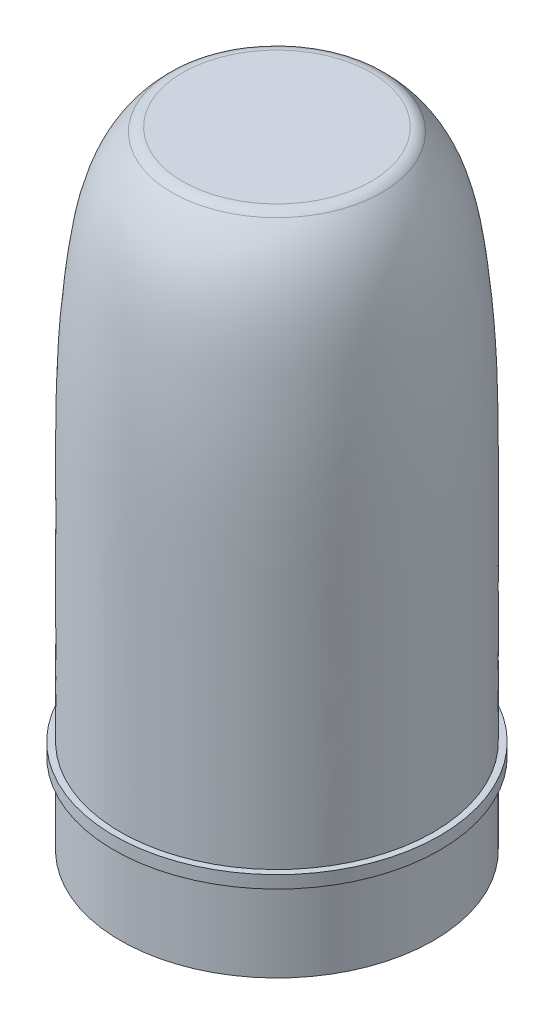
ISO-10303-21;
HEADER;
FILE_DESCRIPTION(('STEP AP214'),'2;1');
FILE_NAME('part.step','',(''),(''),'','','');
FILE_SCHEMA(('AUTOMOTIVE_DESIGN { 1 0 10303 214 1 1 1 1 }'));
ENDSEC;
DATA;
#1=APPLICATION_CONTEXT('core data for automotive mechanical design processes');
#2=APPLICATION_PROTOCOL_DEFINITION('international standard','automotive_design',2000,#1);
#3=PRODUCT_CONTEXT('',#1,'mechanical');
#4=PRODUCT('Part','Part','',(#3));
#5=PRODUCT_RELATED_PRODUCT_CATEGORY('part','',(#4));
#6=PRODUCT_DEFINITION_FORMATION('','',#4);
#7=PRODUCT_DEFINITION_CONTEXT('part definition',#1,'design');
#8=PRODUCT_DEFINITION('design','',#6,#7);
#9=PRODUCT_DEFINITION_SHAPE('','',#8);
#10=(LENGTH_UNIT() NAMED_UNIT(*) SI_UNIT(.MILLI.,.METRE.));
#11=(NAMED_UNIT(*) PLANE_ANGLE_UNIT() SI_UNIT($,.RADIAN.));
#12=(NAMED_UNIT(*) SI_UNIT($,.STERADIAN.) SOLID_ANGLE_UNIT());
#13=UNCERTAINTY_MEASURE_WITH_UNIT(LENGTH_MEASURE(1.E-05),#10,'distance_accuracy_value','');
#14=(GEOMETRIC_REPRESENTATION_CONTEXT(3) GLOBAL_UNCERTAINTY_ASSIGNED_CONTEXT((#13)) GLOBAL_UNIT_ASSIGNED_CONTEXT((#10,
#11,#12)) REPRESENTATION_CONTEXT('',''));
#15=CARTESIAN_POINT('',(0.,0.,0.));
#16=DIRECTION('',(0.,0.,1.));
#17=DIRECTION('',(1.,0.,0.));
#18=AXIS2_PLACEMENT_3D('',#15,#16,#17);
#19=CARTESIAN_POINT('',(0.,136.089238845144,0.));
#20=DIRECTION('',(0.,1.,0.));
#21=DIRECTION('',(-1.,0.,0.));
#22=AXIS2_PLACEMENT_3D('',#19,#20,#21);
#23=PLANE('',#22);
#24=CARTESIAN_POINT('',(0.,136.089238845144,0.));
#25=DIRECTION('',(0.,1.,0.));
#26=DIRECTION('',(-1.,0.,0.));
#27=AXIS2_PLACEMENT_3D('',#24,#25,#26);
#28=CIRCLE('',#27,30.1161809415321);
#29=CARTESIAN_POINT('',(-30.1161809415321,136.089238845144,0.));
#30=VERTEX_POINT('',#29);
#31=EDGE_CURVE('E10',#30,#30,#28,.T.);
#32=ORIENTED_EDGE('',*,*,#31,.T.);
#33=EDGE_LOOP('',(#32));
#34=FACE_BOUND('',#33,.T.);
#35=ADVANCED_FACE('F32',(#34),#23,.T.);
#36=CARTESIAN_POINT('',(50.,-35.9107611548556,0.));
#37=CARTESIAN_POINT('',(50.,-35.244094488189,0.));
#38=CARTESIAN_POINT('',(50.,-34.5774278215223,0.));
#39=CARTESIAN_POINT('',(50.,-33.9107611548557,0.));
#40=CARTESIAN_POINT('',(50.,-14.8788054545156,0.));
#41=CARTESIAN_POINT('',(49.9770326751951,15.5937770638381,0.));
#42=CARTESIAN_POINT('',(50.0284303503971,66.0334666511325,0.));
#43=CARTESIAN_POINT('',(49.0347974443936,90.86573887531,0.));
#44=CARTESIAN_POINT('',(43.5244085837036,126.615462550547,0.));
#45=CARTESIAN_POINT('',(32.,136.089238845144,0.));
#46=B_SPLINE_CURVE_WITH_KNOTS('',3,(#36,#37,#38,#39,#40,#41,#42,#43,#44,#45),.UNSPECIFIED.,.F.,
.F.,(4,3,1,1,1,4),(-0.0110858120131928,0.,0.316477024706082,0.388370289544209,0.71893264838127,
1.),.UNSPECIFIED.);
#47=CARTESIAN_POINT('',(0.,-63.9107611548556,0.));
#48=DIRECTION('',(0.,-1.,0.));
#49=AXIS1_PLACEMENT('',#47,#48);
#50=SURFACE_OF_REVOLUTION('',#46,#49);
#51=CARTESIAN_POINT('',(0.,134.726765899722,0.));
#52=DIRECTION('',(0.,-1.,0.));
#53=DIRECTION('',(1.,0.,0.));
#54=AXIS2_PLACEMENT_3D('',#51,#52,#53);
#55=CIRCLE('',#54,33.5466906598119);
#56=CARTESIAN_POINT('',(33.5466906598119,134.726765899722,0.));
#57=VERTEX_POINT('',#56);
#58=EDGE_CURVE('E39',#57,#57,#55,.T.);
#59=ORIENTED_EDGE('',*,*,#58,.T.);
#60=EDGE_LOOP('',(#59));
#61=FACE_BOUND('',#60,.T.);
#62=CARTESIAN_POINT('',(0.,-33.9107611548557,0.));
#63=DIRECTION('',(0.,-1.,0.));
#64=DIRECTION('',(1.,0.,0.));
#65=AXIS2_PLACEMENT_3D('',#62,#63,#64);
#66=CIRCLE('',#65,50.);
#67=CARTESIAN_POINT('',(50.,-33.9107611548557,0.));
#68=VERTEX_POINT('',#67);
#69=EDGE_CURVE('E43',#68,#68,#66,.T.);
#70=ORIENTED_EDGE('',*,*,#69,.F.);
#71=EDGE_LOOP('',(#70));
#72=FACE_BOUND('',#71,.T.);
#73=ADVANCED_FACE('F72',(#61,#72),#50,.F.);
#74=CARTESIAN_POINT('',(52.,-33.9107611548557,0.));
#75=DIRECTION('',(0.,1.,0.));
#76=DIRECTION('',(-1.,0.,0.));
#77=AXIS2_PLACEMENT_3D('',#74,#75,#76);
#78=PLANE('',#77);
#79=ORIENTED_EDGE('',*,*,#69,.T.);
#80=EDGE_LOOP('',(#79));
#81=FACE_BOUND('',#80,.T.);
#82=CARTESIAN_POINT('',(0.,-33.9107611548557,0.));
#83=DIRECTION('',(0.,-1.,0.));
#84=DIRECTION('',(1.,0.,0.));
#85=AXIS2_PLACEMENT_3D('',#82,#83,#84);
#86=CIRCLE('',#85,52.);
#87=CARTESIAN_POINT('',(52.,-33.9107611548557,0.));
#88=VERTEX_POINT('',#87);
#89=EDGE_CURVE('E47',#88,#88,#86,.T.);
#90=ORIENTED_EDGE('',*,*,#89,.F.);
#91=EDGE_LOOP('',(#90));
#92=FACE_BOUND('',#91,.T.);
#93=ADVANCED_FACE('F77',(#81,#92),#78,.T.);
#94=CARTESIAN_POINT('',(0.,-63.9107611548556,0.));
#95=DIRECTION('',(0.,-1.,0.));
#96=DIRECTION('',(1.,0.,0.));
#97=AXIS2_PLACEMENT_3D('',#94,#95,#96);
#98=CYLINDRICAL_SURFACE('',#97,52.);
#99=ORIENTED_EDGE('',*,*,#89,.T.);
#100=EDGE_LOOP('',(#99));
#101=FACE_BOUND('',#100,.T.);
#102=CARTESIAN_POINT('',(0.,-37.9107611548557,0.));
#103=DIRECTION('',(0.,-1.,0.));
#104=DIRECTION('',(1.,0.,0.));
#105=AXIS2_PLACEMENT_3D('',#102,#103,#104);
#106=CIRCLE('',#105,52.);
#107=CARTESIAN_POINT('',(52.,-37.9107611548557,0.));
#108=VERTEX_POINT('',#107);
#109=EDGE_CURVE('E52',#108,#108,#106,.T.);
#110=ORIENTED_EDGE('',*,*,#109,.F.);
#111=EDGE_LOOP('',(#110));
#112=FACE_BOUND('',#111,.T.);
#113=ADVANCED_FACE('F99',(#101,#112),#98,.T.);
#114=CARTESIAN_POINT('',(50.,-37.9107611548557,0.));
#115=DIRECTION('',(0.,-1.,0.));
#116=DIRECTION('',(1.,0.,0.));
#117=AXIS2_PLACEMENT_3D('',#114,#115,#116);
#118=PLANE('',#117);
#119=ORIENTED_EDGE('',*,*,#109,.T.);
#120=EDGE_LOOP('',(#119));
#121=FACE_BOUND('',#120,.T.);
#122=CARTESIAN_POINT('',(0.,-37.9107611548557,0.));
#123=DIRECTION('',(0.,-1.,0.));
#124=DIRECTION('',(1.,0.,0.));
#125=AXIS2_PLACEMENT_3D('',#122,#123,#124);
#126=CIRCLE('',#125,50.);
#127=CARTESIAN_POINT('',(50.,-37.9107611548557,0.));
#128=VERTEX_POINT('',#127);
#129=EDGE_CURVE('E55',#128,#128,#126,.T.);
#130=ORIENTED_EDGE('',*,*,#129,.F.);
#131=EDGE_LOOP('',(#130));
#132=FACE_BOUND('',#131,.T.);
#133=ADVANCED_FACE('F95',(#121,#132),#118,.T.);
#134=CARTESIAN_POINT('',(0.,-63.9107611548556,0.));
#135=DIRECTION('',(0.,-1.,0.));
#136=DIRECTION('',(1.,0.,0.));
#137=AXIS2_PLACEMENT_3D('',#134,#135,#136);
#138=CYLINDRICAL_SURFACE('',#137,50.);
#139=ORIENTED_EDGE('',*,*,#129,.T.);
#140=EDGE_LOOP('',(#139));
#141=FACE_BOUND('',#140,.T.);
#142=CARTESIAN_POINT('',(0.,-63.9107611548556,0.));
#143=DIRECTION('',(0.,-1.,0.));
#144=DIRECTION('',(1.,0.,0.));
#145=AXIS2_PLACEMENT_3D('',#142,#143,#144);
#146=CIRCLE('',#145,50.);
#147=CARTESIAN_POINT('',(50.,-63.9107611548556,0.));
#148=VERTEX_POINT('',#147);
#149=EDGE_CURVE('E58',#148,#148,#146,.T.);
#150=ORIENTED_EDGE('',*,*,#149,.F.);
#151=EDGE_LOOP('',(#150));
#152=FACE_BOUND('',#151,.T.);
#153=ADVANCED_FACE('F91',(#141,#152),#138,.T.);
#154=CARTESIAN_POINT('',(0.,-63.9107611548556,0.));
#155=DIRECTION('',(0.,-1.,0.));
#156=DIRECTION('',(1.,0.,0.));
#157=AXIS2_PLACEMENT_3D('',#154,#155,#156);
#158=PLANE('',#157);
#159=CARTESIAN_POINT('',(0.,-63.9107611548556,0.));
#160=DIRECTION('',(0.,-1.,0.));
#161=DIRECTION('',(1.,0.,0.));
#162=AXIS2_PLACEMENT_3D('',#159,#160,#161);
#163=CIRCLE('',#162,48.);
#164=CARTESIAN_POINT('',(48.,-63.9107611548556,0.));
#165=VERTEX_POINT('',#164);
#166=EDGE_CURVE('E66',#165,#165,#163,.T.);
#167=ORIENTED_EDGE('',*,*,#166,.F.);
#168=EDGE_LOOP('',(#167));
#169=FACE_BOUND('',#168,.T.);
#170=ORIENTED_EDGE('',*,*,#149,.T.);
#171=EDGE_LOOP('',(#170));
#172=FACE_BOUND('',#171,.T.);
#173=ADVANCED_FACE('F88',(#169,#172),#158,.T.);
#174=CARTESIAN_POINT('',(0.,131.089238845144,0.));
#175=DIRECTION('',(0.,-1.,0.));
#176=DIRECTION('',(1.,0.,0.));
#177=AXIS2_PLACEMENT_3D('',#174,#175,#176);
#178=TOROIDAL_SURFACE('',#177,30.1161809415321,5.);
#179=ORIENTED_EDGE('',*,*,#31,.F.);
#180=EDGE_LOOP('',(#179));
#181=FACE_BOUND('',#180,.T.);
#182=ORIENTED_EDGE('',*,*,#58,.F.);
#183=EDGE_LOOP('',(#182));
#184=FACE_BOUND('',#183,.T.);
#185=ADVANCED_FACE('F34',(#181,#184),#178,.T.);
#186=CARTESIAN_POINT('',(0.,134.089238845144,0.));
#187=DIRECTION('',(0.,1.,0.));
#188=DIRECTION('',(-1.,0.,0.));
#189=AXIS2_PLACEMENT_3D('',#186,#187,#188);
#190=PLANE('',#189);
#191=CARTESIAN_POINT('',(0.,134.089238845144,0.));
#192=DIRECTION('',(0.,-1.,0.));
#193=DIRECTION('',(1.,0.,0.));
#194=AXIS2_PLACEMENT_3D('',#191,#192,#193);
#195=CIRCLE('',#194,30.1161809415321);
#196=CARTESIAN_POINT('',(30.1161809415321,134.089238845144,0.));
#197=VERTEX_POINT('',#196);
#198=EDGE_CURVE('E61',#197,#197,#195,.F.);
#199=ORIENTED_EDGE('',*,*,#198,.F.);
#200=EDGE_LOOP('',(#199));
#201=FACE_BOUND('',#200,.T.);
#202=ADVANCED_FACE('F140',(#201),#190,.F.);
#203=CARTESIAN_POINT('',(50.,-35.9107611548556,0.));
#204=CARTESIAN_POINT('',(50.,-35.244094488189,0.));
#205=CARTESIAN_POINT('',(50.,-34.5774278215223,0.));
#206=CARTESIAN_POINT('',(50.,-14.8788054545156,0.));
#207=CARTESIAN_POINT('',(49.9770326751951,15.5937770638381,0.));
#208=CARTESIAN_POINT('',(50.0284303503971,66.0334666511325,0.));
#209=CARTESIAN_POINT('',(49.0347974443936,90.86573887531,0.));
#210=CARTESIAN_POINT('',(43.5244085837036,126.615462550547,0.));
#211=CARTESIAN_POINT('',(32.,136.089238845144,0.));
#212=B_SPLINE_CURVE_WITH_KNOTS('',3,(#203,#204,#205,#206,#207,#208,#209,#210,#211),
.UNSPECIFIED.,.F.,.F.,(4,2,1,1,1,4),(-0.0110858120131928,0.,0.316477024706082,0.388370289544209,
0.71893264838127,1.),.UNSPECIFIED.);
#213=CARTESIAN_POINT('',(0.,-63.9107611548556,0.));
#214=DIRECTION('',(0.,-1.,0.));
#215=AXIS1_PLACEMENT('',#213,#214);
#216=SURFACE_OF_REVOLUTION('',#212,#215);
#217=OFFSET_SURFACE('',#216,2.,.F.);
#218=CARTESIAN_POINT('',(0.,133.271755077891,0.));
#219=DIRECTION('',(0.,-1.,0.));
#220=DIRECTION('',(1.,0.,0.));
#221=AXIS2_PLACEMENT_3D('',#218,#219,#220);
#222=CIRCLE('',#221,32.1744867725);
#223=CARTESIAN_POINT('',(32.1744867725,133.271755077891,0.));
#224=VERTEX_POINT('',#223);
#225=EDGE_CURVE('E189',#224,#224,#222,.T.);
#226=ORIENTED_EDGE('',*,*,#225,.F.);
#227=EDGE_LOOP('',(#226));
#228=FACE_BOUND('',#227,.T.);
#229=CARTESIAN_POINT('',(0.,-35.9107611548557,0.));
#230=DIRECTION('',(0.,-1.,0.));
#231=DIRECTION('',(1.,0.,0.));
#232=AXIS2_PLACEMENT_3D('',#229,#230,#231);
#233=CIRCLE('',#232,48.);
#234=CARTESIAN_POINT('',(48.,-35.9107611548557,0.));
#235=VERTEX_POINT('',#234);
#236=EDGE_CURVE('E192',#235,#235,#233,.T.);
#237=ORIENTED_EDGE('',*,*,#236,.T.);
#238=EDGE_LOOP('',(#237));
#239=FACE_BOUND('',#238,.T.);
#240=ADVANCED_FACE('F78',(#228,#239),#217,.T.);
#241=CARTESIAN_POINT('',(0.,-63.9107611548556,0.));
#242=DIRECTION('',(0.,-1.,0.));
#243=DIRECTION('',(1.,0.,0.));
#244=AXIS2_PLACEMENT_3D('',#241,#242,#243);
#245=CYLINDRICAL_SURFACE('',#244,48.);
#246=ORIENTED_EDGE('',*,*,#236,.F.);
#247=EDGE_LOOP('',(#246));
#248=FACE_BOUND('',#247,.T.);
#249=ORIENTED_EDGE('',*,*,#166,.T.);
#250=EDGE_LOOP('',(#249));
#251=FACE_BOUND('',#250,.T.);
#252=ADVANCED_FACE('F80',(#248,#251),#245,.F.);
#253=CARTESIAN_POINT('',(0.,131.089238845144,0.));
#254=DIRECTION('',(0.,-1.,0.));
#255=DIRECTION('',(1.,0.,0.));
#256=AXIS2_PLACEMENT_3D('',#253,#254,#255);
#257=TOROIDAL_SURFACE('',#256,30.1161809415321,3.);
#258=ORIENTED_EDGE('',*,*,#198,.T.);
#259=EDGE_LOOP('',(#258));
#260=FACE_BOUND('',#259,.T.);
#261=ORIENTED_EDGE('',*,*,#225,.T.);
#262=EDGE_LOOP('',(#261));
#263=FACE_BOUND('',#262,.T.);
#264=ADVANCED_FACE('F83',(#260,#263),#257,.F.);
#265=CLOSED_SHELL('',(#35,#73,#93,#113,#133,#153,#173,#185,#202,#240,#252,#264));
#266=MANIFOLD_SOLID_BREP('B2',#265);
#267=ADVANCED_BREP_SHAPE_REPRESENTATION('',(#18,#266),#14);
#268=SHAPE_DEFINITION_REPRESENTATION(#9,#267);
ENDSEC;
END-ISO-10303-21;
